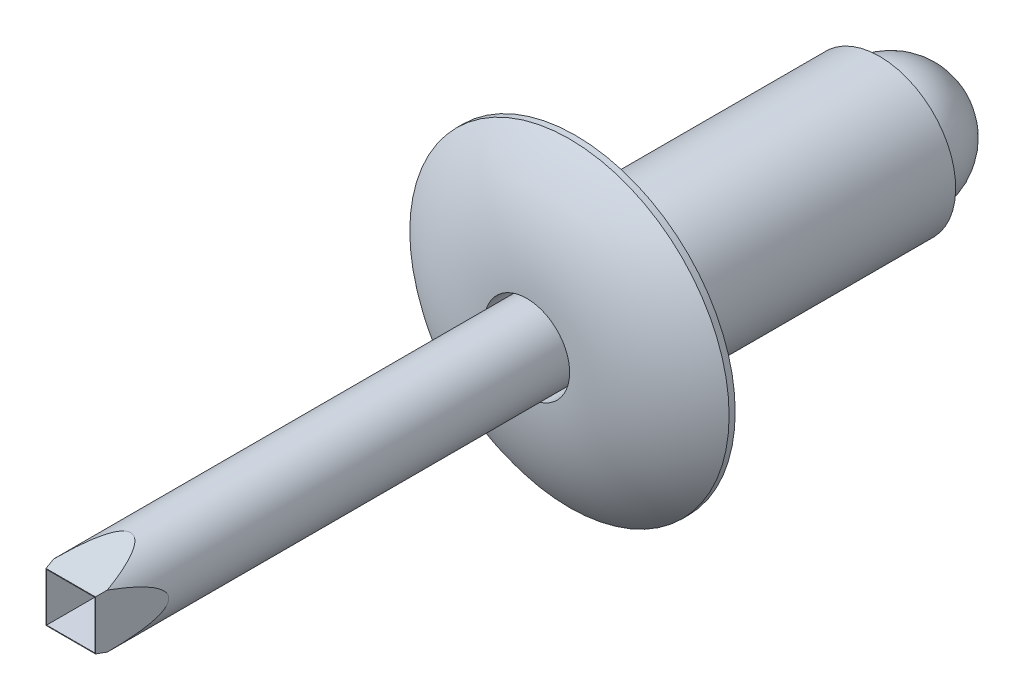
ISO-10303-21;
HEADER;
FILE_DESCRIPTION(('STEP AP214'),'2;1');
FILE_NAME('part.step','',(''),(''),'','','');
FILE_SCHEMA(('AUTOMOTIVE_DESIGN { 1 0 10303 214 1 1 1 1 }'));
ENDSEC;
DATA;
#1=APPLICATION_CONTEXT('core data for automotive mechanical design processes');
#2=APPLICATION_PROTOCOL_DEFINITION('international standard','automotive_design',2000,#1);
#3=PRODUCT_CONTEXT('',#1,'mechanical');
#4=PRODUCT('Part','Part','',(#3));
#5=PRODUCT_RELATED_PRODUCT_CATEGORY('part','',(#4));
#6=PRODUCT_DEFINITION_FORMATION('','',#4);
#7=PRODUCT_DEFINITION_CONTEXT('part definition',#1,'design');
#8=PRODUCT_DEFINITION('design','',#6,#7);
#9=PRODUCT_DEFINITION_SHAPE('','',#8);
#10=(LENGTH_UNIT() NAMED_UNIT(*) SI_UNIT(.MILLI.,.METRE.));
#11=(NAMED_UNIT(*) PLANE_ANGLE_UNIT() SI_UNIT($,.RADIAN.));
#12=(NAMED_UNIT(*) SI_UNIT($,.STERADIAN.) SOLID_ANGLE_UNIT());
#13=UNCERTAINTY_MEASURE_WITH_UNIT(LENGTH_MEASURE(1.E-05),#10,'distance_accuracy_value','');
#14=(GEOMETRIC_REPRESENTATION_CONTEXT(3) GLOBAL_UNCERTAINTY_ASSIGNED_CONTEXT((#13)) GLOBAL_UNIT_ASSIGNED_CONTEXT((#10,
#11,#12)) REPRESENTATION_CONTEXT('',''));
#15=CARTESIAN_POINT('',(0.,0.,0.));
#16=DIRECTION('',(0.,0.,1.));
#17=DIRECTION('',(1.,0.,0.));
#18=AXIS2_PLACEMENT_3D('',#15,#16,#17);
#19=CARTESIAN_POINT('',(0.,0.,-13.1656666666667));
#20=DIRECTION('',(0.,0.,1.));
#21=DIRECTION('',(0.,1.,0.));
#22=AXIS2_PLACEMENT_3D('',#19,#20,#21);
#23=SPHERICAL_SURFACE('',#22,2.58233333333333);
#24=CARTESIAN_POINT('',(0.,0.,-12.7));
#25=DIRECTION('',(0.,0.,1.));
#26=DIRECTION('',(1.,0.,0.));
#27=AXIS2_PLACEMENT_3D('',#24,#25,#26);
#28=CIRCLE('',#27,2.54);
#29=CARTESIAN_POINT('',(2.54,0.,-12.7));
#30=VERTEX_POINT('',#29);
#31=EDGE_CURVE('E11',#30,#30,#28,.T.);
#32=ORIENTED_EDGE('',*,*,#31,.F.);
#33=EDGE_LOOP('',(#32));
#34=FACE_BOUND('',#33,.T.);
#35=ADVANCED_FACE('F46',(#34),#23,.T.);
#36=CARTESIAN_POINT('',(0.,2.54,-12.7));
#37=DIRECTION('',(0.,0.,-1.));
#38=DIRECTION('',(-1.,0.,0.));
#39=AXIS2_PLACEMENT_3D('',#36,#37,#38);
#40=PLANE('',#39);
#41=ORIENTED_EDGE('',*,*,#31,.T.);
#42=EDGE_LOOP('',(#41));
#43=FACE_BOUND('',#42,.T.);
#44=ADVANCED_FACE('F53',(#43),#40,.F.);
#45=CLOSED_SHELL('',(#35,#44));
#46=MANIFOLD_SOLID_BREP('B2',#45);
#47=CARTESIAN_POINT('',(0.,0.,21.082));
#48=DIRECTION('',(0.,0.,-1.));
#49=DIRECTION('',(-1.,0.,0.));
#50=AXIS2_PLACEMENT_3D('',#47,#48,#49);
#51=PLANE('',#50);
#52=DIRECTION('',(1.,0.,0.));
#53=VECTOR('',#52,1.);
#54=CARTESIAN_POINT('',(-1.006475,-1.006475,21.082));
#55=LINE('',#54,#53);
#56=CARTESIAN_POINT('',(-1.006475,-1.006475,21.082));
#57=VERTEX_POINT('',#56);
#58=CARTESIAN_POINT('',(1.006475,-1.006475,21.082));
#59=VERTEX_POINT('',#58);
#60=EDGE_CURVE('E171',#57,#59,#55,.T.);
#61=ORIENTED_EDGE('',*,*,#60,.F.);
#62=DIRECTION('',(0.,-1.,0.));
#63=VECTOR('',#62,1.);
#64=CARTESIAN_POINT('',(-1.006475,1.006475,21.082));
#65=LINE('',#64,#63);
#66=CARTESIAN_POINT('',(-1.006475,1.006475,21.082));
#67=VERTEX_POINT('',#66);
#68=EDGE_CURVE('E93',#67,#57,#65,.T.);
#69=ORIENTED_EDGE('',*,*,#68,.F.);
#70=DIRECTION('',(-1.,0.,0.));
#71=VECTOR('',#70,1.);
#72=CARTESIAN_POINT('',(1.006475,1.00647500000001,21.082));
#73=LINE('',#72,#71);
#74=CARTESIAN_POINT('',(1.006475,1.00647500000001,21.082));
#75=VERTEX_POINT('',#74);
#76=EDGE_CURVE('E162',#75,#67,#73,.T.);
#77=ORIENTED_EDGE('',*,*,#76,.F.);
#78=DIRECTION('',(0.,1.,0.));
#79=VECTOR('',#78,1.);
#80=CARTESIAN_POINT('',(1.006475,-1.006475,21.082));
#81=LINE('',#80,#79);
#82=EDGE_CURVE('E165',#59,#75,#81,.T.);
#83=ORIENTED_EDGE('',*,*,#82,.F.);
#84=EDGE_LOOP('',(#61,#69,#77,#83));
#85=FACE_BOUND('',#84,.T.);
#86=DIRECTION('',(0.,1.,0.));
#87=VECTOR('',#86,1.);
#88=CARTESIAN_POINT('',(-1.031875,-6.6675,21.082));
#89=LINE('',#88,#87);
#90=CARTESIAN_POINT('',(-1.031875,-1.031875,21.082));
#91=VERTEX_POINT('',#90);
#92=CARTESIAN_POINT('',(-1.031875,1.031875,21.082));
#93=VERTEX_POINT('',#92);
#94=EDGE_CURVE('E196',#91,#93,#89,.T.);
#95=ORIENTED_EDGE('',*,*,#94,.F.);
#96=DIRECTION('',(1.,0.,0.));
#97=VECTOR('',#96,1.);
#98=CARTESIAN_POINT('',(-1.58750000000001,-1.03187499999999,21.082));
#99=LINE('',#98,#97);
#100=CARTESIAN_POINT('',(1.031875,-1.031875,21.082));
#101=VERTEX_POINT('',#100);
#102=EDGE_CURVE('E177',#91,#101,#99,.T.);
#103=ORIENTED_EDGE('',*,*,#102,.T.);
#104=DIRECTION('',(0.,1.,0.));
#105=VECTOR('',#104,1.);
#106=CARTESIAN_POINT('',(1.031875,-6.6675,21.082));
#107=LINE('',#106,#105);
#108=CARTESIAN_POINT('',(1.031875,1.03187500000001,21.082));
#109=VERTEX_POINT('',#108);
#110=EDGE_CURVE('E195',#101,#109,#107,.T.);
#111=ORIENTED_EDGE('',*,*,#110,.T.);
#112=DIRECTION('',(1.,0.,0.));
#113=VECTOR('',#112,1.);
#114=CARTESIAN_POINT('',(-1.5875,1.03187500000001,21.082));
#115=LINE('',#114,#113);
#116=EDGE_CURVE('E181',#93,#109,#115,.T.);
#117=ORIENTED_EDGE('',*,*,#116,.F.);
#118=EDGE_LOOP('',(#95,#103,#111,#117));
#119=FACE_BOUND('',#118,.T.);
#120=ADVANCED_FACE('F79',(#85,#119),#51,.F.);
#121=CARTESIAN_POINT('',(0.,0.,21.082));
#122=DIRECTION('',(0.,0.,1.));
#123=DIRECTION('',(1.,0.,0.));
#124=AXIS2_PLACEMENT_3D('',#121,#122,#123);
#125=CYLINDRICAL_SURFACE('',#124,1.5875);
#126=CARTESIAN_POINT('',(0.,0.,25.7364873372163));
#127=DIRECTION('',(-0.976296007119934,0.,-0.216439613938101));
#128=DIRECTION('',(-0.216439613938101,0.,0.976296007119934));
#129=AXIS2_PLACEMENT_3D('',#126,#127,#128);
#130=ELLIPSE('',#129,7.33460927561074,1.5875);
#131=CARTESIAN_POINT('',(1.12253201513365,1.12253201513364,20.67307263092));
#132=VERTEX_POINT('',#131);
#133=CARTESIAN_POINT('',(1.12253201513364,-1.12253201513365,20.6730726309201));
#134=VERTEX_POINT('',#133);
#135=EDGE_CURVE('E207',#132,#134,#130,.T.);
#136=ORIENTED_EDGE('',*,*,#135,.T.);
#137=CARTESIAN_POINT('',(0.,0.,25.7364873372163));
#138=DIRECTION('',(0.,0.976296007119934,-0.216439613938101));
#139=DIRECTION('',(0.,0.216439613938101,0.976296007119934));
#140=AXIS2_PLACEMENT_3D('',#137,#138,#139);
#141=ELLIPSE('',#140,7.33460927561074,1.5875);
#142=CARTESIAN_POINT('',(-1.12253201513365,-1.12253201513364,20.67307263092));
#143=VERTEX_POINT('',#142);
#144=EDGE_CURVE('E101',#134,#143,#141,.T.);
#145=ORIENTED_EDGE('',*,*,#144,.T.);
#146=CARTESIAN_POINT('',(0.,0.,25.7364873372163));
#147=DIRECTION('',(0.976296007119934,0.,-0.2164396139381));
#148=DIRECTION('',(0.2164396139381,0.,0.976296007119934));
#149=AXIS2_PLACEMENT_3D('',#146,#147,#148);
#150=ELLIPSE('',#149,7.33460927561075,1.5875);
#151=CARTESIAN_POINT('',(-1.12253201513364,1.12253201513365,20.6730726309201));
#152=VERTEX_POINT('',#151);
#153=EDGE_CURVE('E204',#143,#152,#150,.T.);
#154=ORIENTED_EDGE('',*,*,#153,.T.);
#155=CARTESIAN_POINT('',(0.,0.,25.7364873372163));
#156=DIRECTION('',(0.,-0.976296007119934,-0.2164396139381));
#157=DIRECTION('',(0.,-0.2164396139381,0.976296007119934));
#158=AXIS2_PLACEMENT_3D('',#155,#156,#157);
#159=ELLIPSE('',#158,7.33460927561075,1.5875);
#160=EDGE_CURVE('E183',#152,#132,#159,.T.);
#161=ORIENTED_EDGE('',*,*,#160,.T.);
#162=EDGE_LOOP('',(#136,#145,#154,#161));
#163=FACE_BOUND('',#162,.T.);
#164=CARTESIAN_POINT('',(0.,0.,-1.27));
#165=DIRECTION('',(0.,0.,1.));
#166=DIRECTION('',(1.,0.,0.));
#167=AXIS2_PLACEMENT_3D('',#164,#165,#166);
#168=CIRCLE('',#167,1.5875);
#169=CARTESIAN_POINT('',(1.5875,0.,-1.27));
#170=VERTEX_POINT('',#169);
#171=EDGE_CURVE('E199',#170,#170,#168,.T.);
#172=ORIENTED_EDGE('',*,*,#171,.T.);
#173=EDGE_LOOP('',(#172));
#174=FACE_BOUND('',#173,.T.);
#175=ADVANCED_FACE('F223',(#163,#174),#125,.T.);
#176=CARTESIAN_POINT('',(0.,1.5875,-1.27));
#177=DIRECTION('',(0.,0.,1.));
#178=DIRECTION('',(1.,0.,0.));
#179=AXIS2_PLACEMENT_3D('',#176,#177,#178);
#180=PLANE('',#179);
#181=ORIENTED_EDGE('',*,*,#171,.F.);
#182=EDGE_LOOP('',(#181));
#183=FACE_BOUND('',#182,.T.);
#184=ADVANCED_FACE('F240',(#183),#180,.F.);
#185=CARTESIAN_POINT('',(-1.7907,-6.6675,17.6591616197086));
#186=DIRECTION('',(0.976296007119934,0.,-0.2164396139381));
#187=DIRECTION('',(-0.2164396139381,0.,-0.976296007119934));
#188=AXIS2_PLACEMENT_3D('',#185,#186,#187);
#189=PLANE('',#188);
#190=ORIENTED_EDGE('',*,*,#153,.F.);
#191=DIRECTION('',(0.211541378239843,0.211541378239843,0.954201493702863));
#192=VECTOR('',#191,1.);
#193=CARTESIAN_POINT('',(-2.00893560375808,-2.00893560375808,16.6747644260352));
#194=LINE('',#193,#192);
#195=EDGE_CURVE('E192',#143,#91,#194,.T.);
#196=ORIENTED_EDGE('',*,*,#195,.T.);
#197=ORIENTED_EDGE('',*,*,#94,.T.);
#198=DIRECTION('',(-0.211541378239843,0.211541378239844,-0.954201493702863));
#199=VECTOR('',#198,1.);
#200=CARTESIAN_POINT('',(-1.41219762473207,1.41219762473208,19.366475502486));
#201=LINE('',#200,#199);
#202=EDGE_CURVE('E188',#93,#152,#201,.T.);
#203=ORIENTED_EDGE('',*,*,#202,.T.);
#204=EDGE_LOOP('',(#190,#196,#197,#203));
#205=FACE_BOUND('',#204,.T.);
#206=ADVANCED_FACE('F221',(#205),#189,.F.);
#207=CARTESIAN_POINT('',(1.031875,-6.6675,21.082));
#208=DIRECTION('',(-0.976296007119934,0.,-0.216439613938101));
#209=DIRECTION('',(-0.216439613938101,0.,0.976296007119934));
#210=AXIS2_PLACEMENT_3D('',#207,#208,#209);
#211=PLANE('',#210);
#212=ORIENTED_EDGE('',*,*,#110,.F.);
#213=DIRECTION('',(0.211541378239843,-0.211541378239844,-0.954201493702863));
#214=VECTOR('',#213,1.);
#215=CARTESIAN_POINT('',(1.28406783637409,-1.28406783637409,19.9444316284047));
#216=LINE('',#215,#214);
#217=EDGE_CURVE('E44',#101,#134,#216,.T.);
#218=ORIENTED_EDGE('',*,*,#217,.T.);
#219=ORIENTED_EDGE('',*,*,#135,.F.);
#220=DIRECTION('',(-0.211541378239843,-0.211541378239842,0.954201493702863));
#221=VECTOR('',#220,1.);
#222=CARTESIAN_POINT('',(0.687329857348078,0.687329857348077,22.6361427048555));
#223=LINE('',#222,#221);
#224=EDGE_CURVE('E86',#132,#109,#223,.T.);
#225=ORIENTED_EDGE('',*,*,#224,.T.);
#226=EDGE_LOOP('',(#212,#218,#219,#225));
#227=FACE_BOUND('',#226,.T.);
#228=ADVANCED_FACE('F213',(#227),#211,.F.);
#229=CARTESIAN_POINT('',(-1.5875,1.79070000000001,17.6591616197086));
#230=DIRECTION('',(0.,-0.976296007119934,-0.2164396139381));
#231=DIRECTION('',(0.,0.2164396139381,-0.976296007119934));
#232=AXIS2_PLACEMENT_3D('',#229,#230,#231);
#233=PLANE('',#232);
#234=ORIENTED_EDGE('',*,*,#116,.T.);
#235=ORIENTED_EDGE('',*,*,#224,.F.);
#236=ORIENTED_EDGE('',*,*,#160,.F.);
#237=ORIENTED_EDGE('',*,*,#202,.F.);
#238=EDGE_LOOP('',(#234,#235,#236,#237));
#239=FACE_BOUND('',#238,.T.);
#240=ADVANCED_FACE('F225',(#239),#233,.F.);
#241=CARTESIAN_POINT('',(-1.58750000000001,-1.03187499999999,21.082));
#242=DIRECTION('',(0.,0.976296007119934,-0.216439613938101));
#243=DIRECTION('',(0.,0.216439613938101,0.976296007119934));
#244=AXIS2_PLACEMENT_3D('',#241,#242,#243);
#245=PLANE('',#244);
#246=ORIENTED_EDGE('',*,*,#144,.F.);
#247=ORIENTED_EDGE('',*,*,#217,.F.);
#248=ORIENTED_EDGE('',*,*,#102,.F.);
#249=ORIENTED_EDGE('',*,*,#195,.F.);
#250=EDGE_LOOP('',(#246,#247,#248,#249));
#251=FACE_BOUND('',#250,.T.);
#252=ADVANCED_FACE('F218',(#251),#245,.F.);
#253=CARTESIAN_POINT('',(-1.006475,1.006475,18.542));
#254=DIRECTION('',(-1.,0.,0.));
#255=DIRECTION('',(0.,0.,1.));
#256=AXIS2_PLACEMENT_3D('',#253,#254,#255);
#257=PLANE('',#256);
#258=ORIENTED_EDGE('',*,*,#68,.T.);
#259=DIRECTION('',(0.,0.,1.));
#260=VECTOR('',#259,1.);
#261=CARTESIAN_POINT('',(-1.006475,-1.006475,18.542));
#262=LINE('',#261,#260);
#263=CARTESIAN_POINT('',(-1.006475,-1.006475,18.542));
#264=VERTEX_POINT('',#263);
#265=EDGE_CURVE('E140',#264,#57,#262,.T.);
#266=ORIENTED_EDGE('',*,*,#265,.F.);
#267=DIRECTION('',(0.,-1.,0.));
#268=VECTOR('',#267,1.);
#269=CARTESIAN_POINT('',(-1.006475,1.006475,18.542));
#270=LINE('',#269,#268);
#271=CARTESIAN_POINT('',(-1.006475,1.006475,18.542));
#272=VERTEX_POINT('',#271);
#273=EDGE_CURVE('E144',#272,#264,#270,.T.);
#274=ORIENTED_EDGE('',*,*,#273,.F.);
#275=DIRECTION('',(0.,0.,1.));
#276=VECTOR('',#275,1.);
#277=CARTESIAN_POINT('',(-1.006475,1.006475,18.542));
#278=LINE('',#277,#276);
#279=EDGE_CURVE('E175',#272,#67,#278,.T.);
#280=ORIENTED_EDGE('',*,*,#279,.T.);
#281=EDGE_LOOP('',(#258,#266,#274,#280));
#282=FACE_BOUND('',#281,.T.);
#283=ADVANCED_FACE('F142',(#282),#257,.F.);
#284=CARTESIAN_POINT('',(1.006475,1.00647500000001,18.542));
#285=DIRECTION('',(0.,1.,0.));
#286=DIRECTION('',(-1.,0.,0.));
#287=AXIS2_PLACEMENT_3D('',#284,#285,#286);
#288=PLANE('',#287);
#289=ORIENTED_EDGE('',*,*,#76,.T.);
#290=ORIENTED_EDGE('',*,*,#279,.F.);
#291=DIRECTION('',(-1.,0.,0.));
#292=VECTOR('',#291,1.);
#293=CARTESIAN_POINT('',(1.006475,1.00647500000001,18.542));
#294=LINE('',#293,#292);
#295=CARTESIAN_POINT('',(1.006475,1.00647500000001,18.542));
#296=VERTEX_POINT('',#295);
#297=EDGE_CURVE('E150',#296,#272,#294,.T.);
#298=ORIENTED_EDGE('',*,*,#297,.F.);
#299=DIRECTION('',(0.,0.,1.));
#300=VECTOR('',#299,1.);
#301=CARTESIAN_POINT('',(1.006475,1.00647500000001,18.542));
#302=LINE('',#301,#300);
#303=EDGE_CURVE('E178',#296,#75,#302,.T.);
#304=ORIENTED_EDGE('',*,*,#303,.T.);
#305=EDGE_LOOP('',(#289,#290,#298,#304));
#306=FACE_BOUND('',#305,.T.);
#307=ADVANCED_FACE('F246',(#306),#288,.F.);
#308=CARTESIAN_POINT('',(1.006475,-1.006475,18.542));
#309=DIRECTION('',(1.,0.,0.));
#310=DIRECTION('',(0.,1.,0.));
#311=AXIS2_PLACEMENT_3D('',#308,#309,#310);
#312=PLANE('',#311);
#313=ORIENTED_EDGE('',*,*,#82,.T.);
#314=ORIENTED_EDGE('',*,*,#303,.F.);
#315=DIRECTION('',(0.,1.,0.));
#316=VECTOR('',#315,1.);
#317=CARTESIAN_POINT('',(1.006475,-1.006475,18.542));
#318=LINE('',#317,#316);
#319=CARTESIAN_POINT('',(1.006475,-1.006475,18.542));
#320=VERTEX_POINT('',#319);
#321=EDGE_CURVE('E158',#320,#296,#318,.T.);
#322=ORIENTED_EDGE('',*,*,#321,.F.);
#323=DIRECTION('',(0.,0.,1.));
#324=VECTOR('',#323,1.);
#325=CARTESIAN_POINT('',(1.006475,-1.006475,18.542));
#326=LINE('',#325,#324);
#327=EDGE_CURVE('E149',#320,#59,#326,.T.);
#328=ORIENTED_EDGE('',*,*,#327,.T.);
#329=EDGE_LOOP('',(#313,#314,#322,#328));
#330=FACE_BOUND('',#329,.T.);
#331=ADVANCED_FACE('F244',(#330),#312,.F.);
#332=CARTESIAN_POINT('',(-1.006475,-1.006475,18.542));
#333=DIRECTION('',(0.,-1.,0.));
#334=DIRECTION('',(1.,0.,0.));
#335=AXIS2_PLACEMENT_3D('',#332,#333,#334);
#336=PLANE('',#335);
#337=ORIENTED_EDGE('',*,*,#60,.T.);
#338=ORIENTED_EDGE('',*,*,#327,.F.);
#339=DIRECTION('',(1.,0.,0.));
#340=VECTOR('',#339,1.);
#341=CARTESIAN_POINT('',(-1.006475,-1.006475,18.542));
#342=LINE('',#341,#340);
#343=EDGE_CURVE('E153',#264,#320,#342,.T.);
#344=ORIENTED_EDGE('',*,*,#343,.F.);
#345=ORIENTED_EDGE('',*,*,#265,.T.);
#346=EDGE_LOOP('',(#337,#338,#344,#345));
#347=FACE_BOUND('',#346,.T.);
#348=ADVANCED_FACE('F154',(#347),#336,.F.);
#349=CARTESIAN_POINT('',(0.,0.,18.542));
#350=DIRECTION('',(0.,0.,1.));
#351=DIRECTION('',(1.,0.,0.));
#352=AXIS2_PLACEMENT_3D('',#349,#350,#351);
#353=PLANE('',#352);
#354=ORIENTED_EDGE('',*,*,#273,.T.);
#355=ORIENTED_EDGE('',*,*,#343,.T.);
#356=ORIENTED_EDGE('',*,*,#321,.T.);
#357=ORIENTED_EDGE('',*,*,#297,.T.);
#358=EDGE_LOOP('',(#354,#355,#356,#357));
#359=FACE_BOUND('',#358,.T.);
#360=ADVANCED_FACE('F160',(#359),#353,.T.);
#361=CLOSED_SHELL('',(#120,#175,#184,#206,#228,#240,#252,#283,#307,#331,#348,#360));
#362=MANIFOLD_SOLID_BREP('B6_NOT_SHOWN',#361);
#363=CARTESIAN_POINT('',(0.,0.,-12.7));
#364=DIRECTION('',(0.,0.,-1.));
#365=DIRECTION('',(0.,1.,0.));
#366=AXIS2_PLACEMENT_3D('',#363,#364,#365);
#367=CYLINDRICAL_SURFACE('',#366,6.6675);
#368=CARTESIAN_POINT('',(0.,0.,0.253999999999997));
#369=DIRECTION('',(0.,0.,-1.));
#370=DIRECTION('',(0.,1.,0.));
#371=AXIS2_PLACEMENT_3D('',#368,#369,#370);
#372=CIRCLE('',#371,6.6675);
#373=CARTESIAN_POINT('',(0.,6.6675,0.253999999999998));
#374=VERTEX_POINT('',#373);
#375=EDGE_CURVE('E344',#374,#374,#372,.T.);
#376=ORIENTED_EDGE('',*,*,#375,.T.);
#377=EDGE_LOOP('',(#376));
#378=FACE_BOUND('',#377,.T.);
#379=CARTESIAN_POINT('',(0.,0.,0.));
#380=DIRECTION('',(0.,0.,-1.));
#381=DIRECTION('',(0.,1.,0.));
#382=AXIS2_PLACEMENT_3D('',#379,#380,#381);
#383=CIRCLE('',#382,6.6675);
#384=CARTESIAN_POINT('',(0.,6.6675,0.));
#385=VERTEX_POINT('',#384);
#386=EDGE_CURVE('E359',#385,#385,#383,.T.);
#387=ORIENTED_EDGE('',*,*,#386,.F.);
#388=EDGE_LOOP('',(#387));
#389=FACE_BOUND('',#388,.T.);
#390=ADVANCED_FACE('F333',(#378,#389),#367,.T.);
#391=CARTESIAN_POINT('',(0.,0.,-5.55825209263392));
#392=DIRECTION('',(0.,0.,-1.));
#393=DIRECTION('',(0.,1.,0.));
#394=AXIS2_PLACEMENT_3D('',#391,#392,#393);
#395=DEGENERATE_TOROIDAL_SURFACE('',#394,1.7859375,7.59025209263392,.T.);
#396=CARTESIAN_POINT('',(0.,0.,2.032));
#397=DIRECTION('',(0.,0.,-1.));
#398=DIRECTION('',(0.,1.,0.));
#399=AXIS2_PLACEMENT_3D('',#396,#397,#398);
#400=CIRCLE('',#399,1.7859375);
#401=CARTESIAN_POINT('',(0.,1.7859375,2.032));
#402=VERTEX_POINT('',#401);
#403=EDGE_CURVE('E348',#402,#402,#400,.T.);
#404=ORIENTED_EDGE('',*,*,#403,.T.);
#405=EDGE_LOOP('',(#404));
#406=FACE_BOUND('',#405,.T.);
#407=ORIENTED_EDGE('',*,*,#375,.F.);
#408=EDGE_LOOP('',(#407));
#409=FACE_BOUND('',#408,.T.);
#410=ADVANCED_FACE('F366',(#406,#409),#395,.T.);
#411=CARTESIAN_POINT('',(0.,0.,-12.7));
#412=DIRECTION('',(0.,0.,-1.));
#413=DIRECTION('',(0.,1.,0.));
#414=AXIS2_PLACEMENT_3D('',#411,#412,#413);
#415=CYLINDRICAL_SURFACE('',#414,1.7859375);
#416=CARTESIAN_POINT('',(0.,0.,-1.27));
#417=DIRECTION('',(0.,0.,-1.));
#418=DIRECTION('',(0.,1.,0.));
#419=AXIS2_PLACEMENT_3D('',#416,#417,#418);
#420=CIRCLE('',#419,1.7859375);
#421=CARTESIAN_POINT('',(0.,1.7859375,-1.27));
#422=VERTEX_POINT('',#421);
#423=EDGE_CURVE('E353',#422,#422,#420,.T.);
#424=ORIENTED_EDGE('',*,*,#423,.T.);
#425=EDGE_LOOP('',(#424));
#426=FACE_BOUND('',#425,.T.);
#427=ORIENTED_EDGE('',*,*,#403,.F.);
#428=EDGE_LOOP('',(#427));
#429=FACE_BOUND('',#428,.T.);
#430=ADVANCED_FACE('F371',(#426,#429),#415,.F.);
#431=CARTESIAN_POINT('',(0.,1.7859375,-1.27));
#432=DIRECTION('',(0.,0.,1.));
#433=DIRECTION('',(0.,-1.,0.));
#434=AXIS2_PLACEMENT_3D('',#431,#432,#433);
#435=PLANE('',#434);
#436=ORIENTED_EDGE('',*,*,#423,.F.);
#437=EDGE_LOOP('',(#436));
#438=FACE_BOUND('',#437,.T.);
#439=ADVANCED_FACE('F377',(#438),#435,.T.);
#440=CARTESIAN_POINT('',(0.,3.175,-12.7));
#441=DIRECTION('',(0.,0.,-1.));
#442=DIRECTION('',(0.,1.,0.));
#443=AXIS2_PLACEMENT_3D('',#440,#441,#442);
#444=PLANE('',#443);
#445=CARTESIAN_POINT('',(0.,0.,-12.7));
#446=DIRECTION('',(0.,0.,-1.));
#447=DIRECTION('',(0.,1.,0.));
#448=AXIS2_PLACEMENT_3D('',#445,#446,#447);
#449=CIRCLE('',#448,3.175);
#450=CARTESIAN_POINT('',(0.,3.175,-12.7));
#451=VERTEX_POINT('',#450);
#452=EDGE_CURVE('E356',#451,#451,#449,.T.);
#453=ORIENTED_EDGE('',*,*,#452,.T.);
#454=EDGE_LOOP('',(#453));
#455=FACE_BOUND('',#454,.T.);
#456=ADVANCED_FACE('F381',(#455),#444,.T.);
#457=CARTESIAN_POINT('',(0.,0.,-12.7));
#458=DIRECTION('',(0.,0.,-1.));
#459=DIRECTION('',(0.,1.,0.));
#460=AXIS2_PLACEMENT_3D('',#457,#458,#459);
#461=CYLINDRICAL_SURFACE('',#460,3.175);
#462=CARTESIAN_POINT('',(0.,0.,-0.254000000000001));
#463=DIRECTION('',(0.,0.,-1.));
#464=DIRECTION('',(0.,1.,0.));
#465=AXIS2_PLACEMENT_3D('',#462,#463,#464);
#466=CIRCLE('',#465,3.175);
#467=CARTESIAN_POINT('',(0.,3.175,-0.254));
#468=VERTEX_POINT('',#467);
#469=EDGE_CURVE('E340',#468,#468,#466,.T.);
#470=ORIENTED_EDGE('',*,*,#469,.T.);
#471=EDGE_LOOP('',(#470));
#472=FACE_BOUND('',#471,.T.);
#473=ORIENTED_EDGE('',*,*,#452,.F.);
#474=EDGE_LOOP('',(#473));
#475=FACE_BOUND('',#474,.T.);
#476=ADVANCED_FACE('F385',(#472,#475),#461,.T.);
#477=CARTESIAN_POINT('',(0.,3.175,0.));
#478=DIRECTION('',(0.,0.,-1.));
#479=DIRECTION('',(0.,1.,0.));
#480=AXIS2_PLACEMENT_3D('',#477,#478,#479);
#481=PLANE('',#480);
#482=CARTESIAN_POINT('',(0.,0.,0.));
#483=DIRECTION('',(0.,0.,-1.));
#484=DIRECTION('',(0.,1.,0.));
#485=AXIS2_PLACEMENT_3D('',#482,#483,#484);
#486=CIRCLE('',#485,3.429);
#487=CARTESIAN_POINT('',(0.,3.429,0.));
#488=VERTEX_POINT('',#487);
#489=EDGE_CURVE('E78',#488,#488,#486,.F.);
#490=ORIENTED_EDGE('',*,*,#489,.T.);
#491=EDGE_LOOP('',(#490));
#492=FACE_BOUND('',#491,.T.);
#493=ORIENTED_EDGE('',*,*,#386,.T.);
#494=EDGE_LOOP('',(#493));
#495=FACE_BOUND('',#494,.T.);
#496=ADVANCED_FACE('F363',(#492,#495),#481,.T.);
#497=CARTESIAN_POINT('',(0.,0.,-0.254000000000001));
#498=DIRECTION('',(0.,0.,-1.));
#499=DIRECTION('',(0.,1.,0.));
#500=AXIS2_PLACEMENT_3D('',#497,#498,#499);
#501=TOROIDAL_SURFACE('',#500,3.429,0.254);
#502=ORIENTED_EDGE('',*,*,#489,.F.);
#503=EDGE_LOOP('',(#502));
#504=FACE_BOUND('',#503,.T.);
#505=ORIENTED_EDGE('',*,*,#469,.F.);
#506=EDGE_LOOP('',(#505));
#507=FACE_BOUND('',#506,.T.);
#508=ADVANCED_FACE('F335',(#504,#507),#501,.F.);
#509=CLOSED_SHELL('',(#390,#410,#430,#439,#456,#476,#496,#508));
#510=MANIFOLD_SOLID_BREP('B38',#509);
#511=ADVANCED_BREP_SHAPE_REPRESENTATION('',(#18,#46,#362,#510),#14);
#512=SHAPE_DEFINITION_REPRESENTATION(#9,#511);
ENDSEC;
END-ISO-10303-21;
